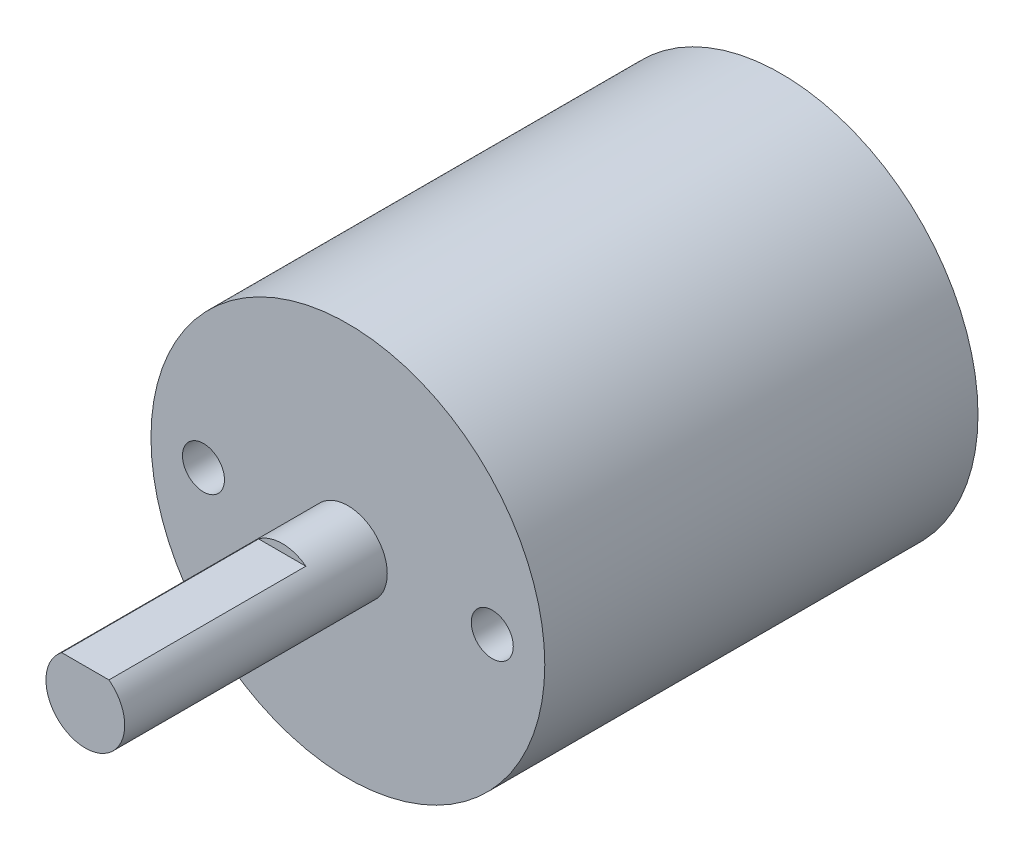
ISO-10303-21;
HEADER;
FILE_DESCRIPTION(('STEP AP214'),'2;1');
FILE_NAME('part.step','',(''),(''),'','','');
FILE_SCHEMA(('AUTOMOTIVE_DESIGN { 1 0 10303 214 1 1 1 1 }'));
ENDSEC;
DATA;
#1=APPLICATION_CONTEXT('core data for automotive mechanical design processes');
#2=APPLICATION_PROTOCOL_DEFINITION('international standard','automotive_design',2000,#1);
#3=PRODUCT_CONTEXT('',#1,'mechanical');
#4=PRODUCT('Part','Part','',(#3));
#5=PRODUCT_RELATED_PRODUCT_CATEGORY('part','',(#4));
#6=PRODUCT_DEFINITION_FORMATION('','',#4);
#7=PRODUCT_DEFINITION_CONTEXT('part definition',#1,'design');
#8=PRODUCT_DEFINITION('design','',#6,#7);
#9=PRODUCT_DEFINITION_SHAPE('','',#8);
#10=(LENGTH_UNIT() NAMED_UNIT(*) SI_UNIT(.MILLI.,.METRE.));
#11=(NAMED_UNIT(*) PLANE_ANGLE_UNIT() SI_UNIT($,.RADIAN.));
#12=(NAMED_UNIT(*) SI_UNIT($,.STERADIAN.) SOLID_ANGLE_UNIT());
#13=UNCERTAINTY_MEASURE_WITH_UNIT(LENGTH_MEASURE(1.E-05),#10,'distance_accuracy_value','');
#14=(GEOMETRIC_REPRESENTATION_CONTEXT(3) GLOBAL_UNCERTAINTY_ASSIGNED_CONTEXT((#13)) GLOBAL_UNIT_ASSIGNED_CONTEXT((#10,
#11,#12)) REPRESENTATION_CONTEXT('',''));
#15=CARTESIAN_POINT('',(0.,0.,0.));
#16=DIRECTION('',(0.,0.,1.));
#17=DIRECTION('',(1.,0.,0.));
#18=AXIS2_PLACEMENT_3D('',#15,#16,#17);
#19=CARTESIAN_POINT('',(0.,0.,16.5));
#20=DIRECTION('',(0.,0.,-1.));
#21=DIRECTION('',(-1.,0.,0.));
#22=AXIS2_PLACEMENT_3D('',#19,#20,#21);
#23=CYLINDRICAL_SURFACE('',#22,7.5);
#24=CARTESIAN_POINT('',(0.,0.,16.5));
#25=DIRECTION('',(0.,0.,1.));
#26=DIRECTION('',(1.,0.,0.));
#27=AXIS2_PLACEMENT_3D('',#24,#25,#26);
#28=CIRCLE('',#27,7.5);
#29=CARTESIAN_POINT('',(7.5,0.,16.5));
#30=VERTEX_POINT('',#29);
#31=EDGE_CURVE('E103',#30,#30,#28,.T.);
#32=ORIENTED_EDGE('',*,*,#31,.F.);
#33=EDGE_LOOP('',(#32));
#34=FACE_BOUND('',#33,.T.);
#35=CARTESIAN_POINT('',(0.,0.,0.));
#36=DIRECTION('',(0.,0.,1.));
#37=DIRECTION('',(1.,0.,0.));
#38=AXIS2_PLACEMENT_3D('',#35,#36,#37);
#39=CIRCLE('',#38,7.5);
#40=CARTESIAN_POINT('',(7.5,0.,0.));
#41=VERTEX_POINT('',#40);
#42=EDGE_CURVE('E99',#41,#41,#39,.T.);
#43=ORIENTED_EDGE('',*,*,#42,.T.);
#44=EDGE_LOOP('',(#43));
#45=FACE_BOUND('',#44,.T.);
#46=ADVANCED_FACE('F39',(#34,#45),#23,.T.);
#47=CARTESIAN_POINT('',(0.,0.,16.5));
#48=DIRECTION('',(0.,0.,1.));
#49=DIRECTION('',(1.,0.,0.));
#50=AXIS2_PLACEMENT_3D('',#47,#48,#49);
#51=PLANE('',#50);
#52=CARTESIAN_POINT('',(5.5,0.,16.5));
#53=DIRECTION('',(0.,0.,1.));
#54=DIRECTION('',(1.,0.,0.));
#55=AXIS2_PLACEMENT_3D('',#52,#53,#54);
#56=CIRCLE('',#55,0.799999999999999);
#57=CARTESIAN_POINT('',(6.3,0.,16.5));
#58=VERTEX_POINT('',#57);
#59=EDGE_CURVE('E82',#58,#58,#56,.T.);
#60=ORIENTED_EDGE('',*,*,#59,.F.);
#61=EDGE_LOOP('',(#60));
#62=FACE_BOUND('',#61,.T.);
#63=CARTESIAN_POINT('',(-5.5,0.,16.5));
#64=DIRECTION('',(0.,0.,1.));
#65=DIRECTION('',(1.,0.,0.));
#66=AXIS2_PLACEMENT_3D('',#63,#64,#65);
#67=CIRCLE('',#66,0.799999999999999);
#68=CARTESIAN_POINT('',(-4.7,0.,16.5));
#69=VERTEX_POINT('',#68);
#70=EDGE_CURVE('E81',#69,#69,#67,.T.);
#71=ORIENTED_EDGE('',*,*,#70,.F.);
#72=EDGE_LOOP('',(#71));
#73=FACE_BOUND('',#72,.T.);
#74=CARTESIAN_POINT('',(0.,0.,16.5));
#75=DIRECTION('',(0.,0.,1.));
#76=DIRECTION('',(1.,0.,0.));
#77=AXIS2_PLACEMENT_3D('',#74,#75,#76);
#78=CIRCLE('',#77,1.5);
#79=CARTESIAN_POINT('',(1.5,0.,16.5));
#80=VERTEX_POINT('',#79);
#81=EDGE_CURVE('E100',#80,#80,#78,.T.);
#82=ORIENTED_EDGE('',*,*,#81,.F.);
#83=EDGE_LOOP('',(#82));
#84=FACE_BOUND('',#83,.T.);
#85=ORIENTED_EDGE('',*,*,#31,.T.);
#86=EDGE_LOOP('',(#85));
#87=FACE_BOUND('',#86,.T.);
#88=ADVANCED_FACE('F127',(#62,#73,#84,#87),#51,.T.);
#89=CARTESIAN_POINT('',(0.,0.,0.));
#90=DIRECTION('',(0.,0.,1.));
#91=DIRECTION('',(1.,0.,0.));
#92=AXIS2_PLACEMENT_3D('',#89,#90,#91);
#93=PLANE('',#92);
#94=ORIENTED_EDGE('',*,*,#42,.F.);
#95=EDGE_LOOP('',(#94));
#96=FACE_BOUND('',#95,.T.);
#97=ADVANCED_FACE('F123',(#96),#93,.F.);
#98=CARTESIAN_POINT('',(0.,0.,26.5));
#99=DIRECTION('',(0.,0.,-1.));
#100=DIRECTION('',(-1.,0.,0.));
#101=AXIS2_PLACEMENT_3D('',#98,#99,#100);
#102=CYLINDRICAL_SURFACE('',#101,1.5);
#103=CARTESIAN_POINT('',(0.,0.,26.5));
#104=DIRECTION('',(0.,0.,1.));
#105=DIRECTION('',(1.,0.,0.));
#106=AXIS2_PLACEMENT_3D('',#103,#104,#105);
#107=CIRCLE('',#106,1.5);
#108=CARTESIAN_POINT('',(-0.9,1.2,26.5));
#109=VERTEX_POINT('',#108);
#110=CARTESIAN_POINT('',(0.9,1.2,26.5));
#111=VERTEX_POINT('',#110);
#112=EDGE_CURVE('E96',#109,#111,#107,.T.);
#113=ORIENTED_EDGE('',*,*,#112,.F.);
#114=DIRECTION('',(0.,0.,-1.));
#115=VECTOR('',#114,1.);
#116=CARTESIAN_POINT('',(-0.9,1.2,26.5));
#117=LINE('',#116,#115);
#118=CARTESIAN_POINT('',(-0.9,1.2,19.));
#119=VERTEX_POINT('',#118);
#120=EDGE_CURVE('E53',#109,#119,#117,.T.);
#121=ORIENTED_EDGE('',*,*,#120,.T.);
#122=CARTESIAN_POINT('',(0.,0.,19.));
#123=DIRECTION('',(0.,0.,-1.));
#124=DIRECTION('',(-1.,0.,0.));
#125=AXIS2_PLACEMENT_3D('',#122,#123,#124);
#126=CIRCLE('',#125,1.5);
#127=CARTESIAN_POINT('',(0.9,1.2,19.));
#128=VERTEX_POINT('',#127);
#129=EDGE_CURVE('E11',#119,#128,#126,.T.);
#130=ORIENTED_EDGE('',*,*,#129,.T.);
#131=DIRECTION('',(0.,0.,-1.));
#132=VECTOR('',#131,1.);
#133=CARTESIAN_POINT('',(0.9,1.2,26.5));
#134=LINE('',#133,#132);
#135=EDGE_CURVE('E58',#128,#111,#134,.F.);
#136=ORIENTED_EDGE('',*,*,#135,.T.);
#137=EDGE_LOOP('',(#113,#121,#130,#136));
#138=FACE_BOUND('',#137,.T.);
#139=ORIENTED_EDGE('',*,*,#81,.T.);
#140=EDGE_LOOP('',(#139));
#141=FACE_BOUND('',#140,.T.);
#142=ADVANCED_FACE('F111',(#138,#141),#102,.T.);
#143=CARTESIAN_POINT('',(0.,0.,26.5));
#144=DIRECTION('',(0.,0.,1.));
#145=DIRECTION('',(1.,0.,0.));
#146=AXIS2_PLACEMENT_3D('',#143,#144,#145);
#147=PLANE('',#146);
#148=DIRECTION('',(1.,0.,0.));
#149=VECTOR('',#148,1.);
#150=CARTESIAN_POINT('',(0.,1.2,26.5));
#151=LINE('',#150,#149);
#152=EDGE_CURVE('E46',#109,#111,#151,.T.);
#153=ORIENTED_EDGE('',*,*,#152,.F.);
#154=ORIENTED_EDGE('',*,*,#112,.T.);
#155=EDGE_LOOP('',(#153,#154));
#156=FACE_BOUND('',#155,.T.);
#157=ADVANCED_FACE('F113',(#156),#147,.T.);
#158=CARTESIAN_POINT('',(0.,0.,19.));
#159=DIRECTION('',(0.,0.,-1.));
#160=DIRECTION('',(-1.,0.,0.));
#161=AXIS2_PLACEMENT_3D('',#158,#159,#160);
#162=PLANE('',#161);
#163=DIRECTION('',(1.,0.,0.));
#164=VECTOR('',#163,1.);
#165=CARTESIAN_POINT('',(2.16759253793726,1.2,19.));
#166=LINE('',#165,#164);
#167=EDGE_CURVE('E92',#119,#128,#166,.T.);
#168=ORIENTED_EDGE('',*,*,#167,.T.);
#169=ORIENTED_EDGE('',*,*,#129,.F.);
#170=EDGE_LOOP('',(#168,#169));
#171=FACE_BOUND('',#170,.T.);
#172=ADVANCED_FACE('F115',(#171),#162,.F.);
#173=CARTESIAN_POINT('',(2.16759253793726,1.2,19.));
#174=DIRECTION('',(0.,-1.,0.));
#175=DIRECTION('',(0.,0.,-1.));
#176=AXIS2_PLACEMENT_3D('',#173,#174,#175);
#177=PLANE('',#176);
#178=ORIENTED_EDGE('',*,*,#152,.T.);
#179=ORIENTED_EDGE('',*,*,#135,.F.);
#180=ORIENTED_EDGE('',*,*,#167,.F.);
#181=ORIENTED_EDGE('',*,*,#120,.F.);
#182=EDGE_LOOP('',(#178,#179,#180,#181));
#183=FACE_BOUND('',#182,.T.);
#184=ADVANCED_FACE('F107',(#183),#177,.F.);
#185=CARTESIAN_POINT('',(-5.5,0.,10.5));
#186=DIRECTION('',(0.,0.,1.));
#187=DIRECTION('',(1.,0.,0.));
#188=AXIS2_PLACEMENT_3D('',#185,#186,#187);
#189=CONICAL_SURFACE('',#188,0.799999999999999,1.0471975511966);
#190=CARTESIAN_POINT('',(-5.5,0.,10.0381197846483));
#191=VERTEX_POINT('',#190);
#192=VERTEX_LOOP('',#191);
#193=FACE_BOUND('',#192,.T.);
#194=CARTESIAN_POINT('',(-5.5,0.,10.5));
#195=DIRECTION('',(0.,0.,1.));
#196=DIRECTION('',(1.,0.,0.));
#197=AXIS2_PLACEMENT_3D('',#194,#195,#196);
#198=CIRCLE('',#197,0.799999999999999);
#199=CARTESIAN_POINT('',(-4.7,0.,10.5));
#200=VERTEX_POINT('',#199);
#201=EDGE_CURVE('E85',#200,#200,#198,.T.);
#202=ORIENTED_EDGE('',*,*,#201,.T.);
#203=EDGE_LOOP('',(#202));
#204=FACE_BOUND('',#203,.T.);
#205=ADVANCED_FACE('F165',(#193,#204),#189,.F.);
#206=CARTESIAN_POINT('',(-5.5,0.,16.5));
#207=DIRECTION('',(0.,0.,1.));
#208=DIRECTION('',(1.,0.,0.));
#209=AXIS2_PLACEMENT_3D('',#206,#207,#208);
#210=CYLINDRICAL_SURFACE('',#209,0.799999999999999);
#211=ORIENTED_EDGE('',*,*,#201,.F.);
#212=EDGE_LOOP('',(#211));
#213=FACE_BOUND('',#212,.T.);
#214=ORIENTED_EDGE('',*,*,#70,.T.);
#215=EDGE_LOOP('',(#214));
#216=FACE_BOUND('',#215,.T.);
#217=ADVANCED_FACE('F75',(#213,#216),#210,.F.);
#218=CARTESIAN_POINT('',(5.5,0.,10.5));
#219=DIRECTION('',(0.,0.,1.));
#220=DIRECTION('',(1.,0.,0.));
#221=AXIS2_PLACEMENT_3D('',#218,#219,#220);
#222=CONICAL_SURFACE('',#221,0.799999999999999,1.0471975511966);
#223=CARTESIAN_POINT('',(5.5,0.,10.0381197846483));
#224=VERTEX_POINT('',#223);
#225=VERTEX_LOOP('',#224);
#226=FACE_BOUND('',#225,.T.);
#227=CARTESIAN_POINT('',(5.5,0.,10.5));
#228=DIRECTION('',(0.,0.,1.));
#229=DIRECTION('',(1.,0.,0.));
#230=AXIS2_PLACEMENT_3D('',#227,#228,#229);
#231=CIRCLE('',#230,0.799999999999999);
#232=CARTESIAN_POINT('',(6.3,0.,10.5));
#233=VERTEX_POINT('',#232);
#234=EDGE_CURVE('E79',#233,#233,#231,.T.);
#235=ORIENTED_EDGE('',*,*,#234,.T.);
#236=EDGE_LOOP('',(#235));
#237=FACE_BOUND('',#236,.T.);
#238=ADVANCED_FACE('F71',(#226,#237),#222,.F.);
#239=CARTESIAN_POINT('',(5.5,0.,16.5));
#240=DIRECTION('',(0.,0.,1.));
#241=DIRECTION('',(1.,0.,0.));
#242=AXIS2_PLACEMENT_3D('',#239,#240,#241);
#243=CYLINDRICAL_SURFACE('',#242,0.799999999999999);
#244=ORIENTED_EDGE('',*,*,#234,.F.);
#245=EDGE_LOOP('',(#244));
#246=FACE_BOUND('',#245,.T.);
#247=ORIENTED_EDGE('',*,*,#59,.T.);
#248=EDGE_LOOP('',(#247));
#249=FACE_BOUND('',#248,.T.);
#250=ADVANCED_FACE('F74',(#246,#249),#243,.F.);
#251=CLOSED_SHELL('',(#46,#88,#97,#142,#157,#172,#184,#205,#217,#238,#250));
#252=MANIFOLD_SOLID_BREP('B2',#251);
#253=ADVANCED_BREP_SHAPE_REPRESENTATION('',(#18,#252),#14);
#254=SHAPE_DEFINITION_REPRESENTATION(#9,#253);
ENDSEC;
END-ISO-10303-21;
